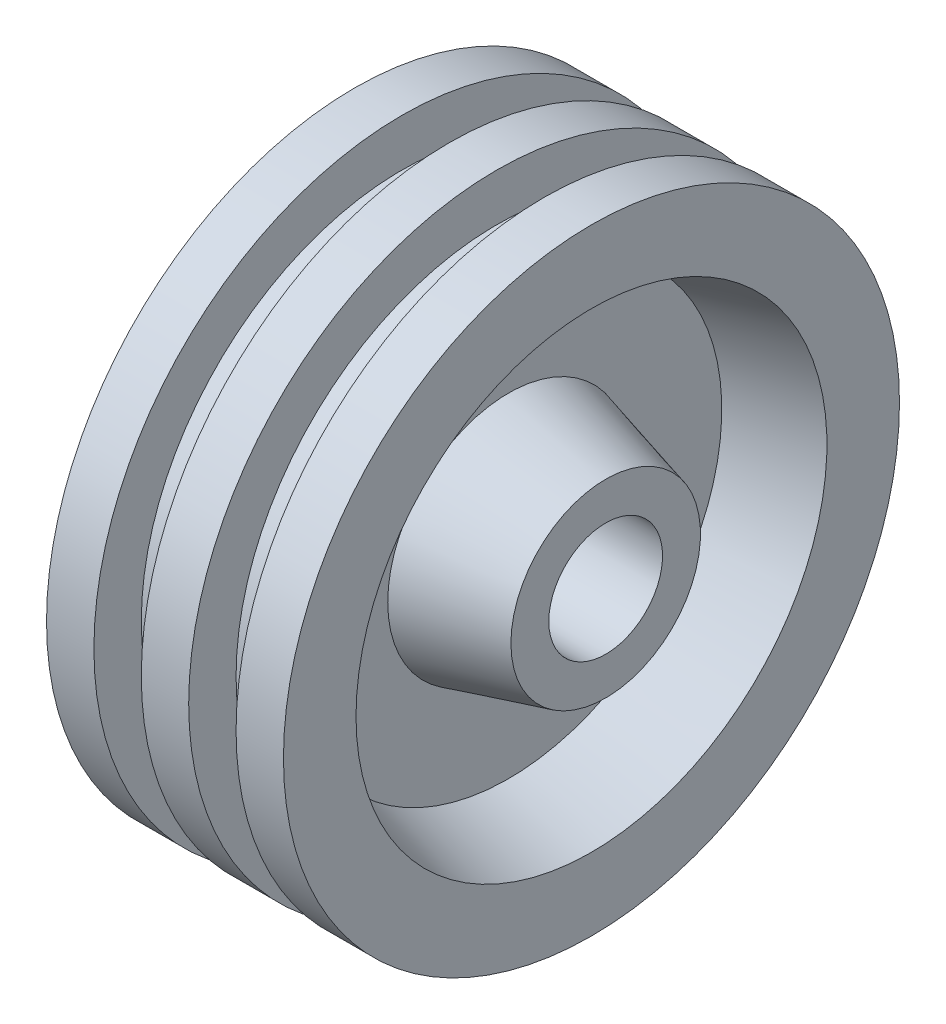
ISO-10303-21;
HEADER;
FILE_DESCRIPTION(('STEP AP214'),'2;1');
FILE_NAME('part.step','',(''),(''),'','','');
FILE_SCHEMA(('AUTOMOTIVE_DESIGN { 1 0 10303 214 1 1 1 1 }'));
ENDSEC;
DATA;
#1=APPLICATION_CONTEXT('core data for automotive mechanical design processes');
#2=APPLICATION_PROTOCOL_DEFINITION('international standard','automotive_design',2000,#1);
#3=PRODUCT_CONTEXT('',#1,'mechanical');
#4=PRODUCT('Part','Part','',(#3));
#5=PRODUCT_RELATED_PRODUCT_CATEGORY('part','',(#4));
#6=PRODUCT_DEFINITION_FORMATION('','',#4);
#7=PRODUCT_DEFINITION_CONTEXT('part definition',#1,'design');
#8=PRODUCT_DEFINITION('design','',#6,#7);
#9=PRODUCT_DEFINITION_SHAPE('','',#8);
#10=(LENGTH_UNIT() NAMED_UNIT(*) SI_UNIT(.MILLI.,.METRE.));
#11=(NAMED_UNIT(*) PLANE_ANGLE_UNIT() SI_UNIT($,.RADIAN.));
#12=(NAMED_UNIT(*) SI_UNIT($,.STERADIAN.) SOLID_ANGLE_UNIT());
#13=UNCERTAINTY_MEASURE_WITH_UNIT(LENGTH_MEASURE(1.E-05),#10,'distance_accuracy_value','');
#14=(GEOMETRIC_REPRESENTATION_CONTEXT(3) GLOBAL_UNCERTAINTY_ASSIGNED_CONTEXT((#13)) GLOBAL_UNIT_ASSIGNED_CONTEXT((#10,
#11,#12)) REPRESENTATION_CONTEXT('',''));
#15=CARTESIAN_POINT('',(0.,0.,0.));
#16=DIRECTION('',(0.,0.,1.));
#17=DIRECTION('',(1.,0.,0.));
#18=AXIS2_PLACEMENT_3D('',#15,#16,#17);
#19=CARTESIAN_POINT('',(-926.286562430031,0.,0.));
#20=DIRECTION('',(-1.,0.,0.));
#21=DIRECTION('',(0.,0.,0.999999999999997));
#22=AXIS2_PLACEMENT_3D('',#19,#20,#21);
#23=CYLINDRICAL_SURFACE('',#22,65.0000000000001);
#24=CARTESIAN_POINT('',(-3.33066907387547E-13,0.,0.));
#25=DIRECTION('',(-1.,0.,0.));
#26=DIRECTION('',(0.,0.,0.999999999999997));
#27=AXIS2_PLACEMENT_3D('',#24,#25,#26);
#28=CIRCLE('',#27,65.0000000000001);
#29=CARTESIAN_POINT('',(-3.33066907387547E-13,0.,65.));
#30=VERTEX_POINT('',#29);
#31=EDGE_CURVE('E12',#30,#30,#28,.T.);
#32=ORIENTED_EDGE('',*,*,#31,.F.);
#33=EDGE_LOOP('',(#32));
#34=FACE_BOUND('',#33,.T.);
#35=CARTESIAN_POINT('',(9.99999999999968,0.,0.));
#36=DIRECTION('',(-1.,0.,0.));
#37=DIRECTION('',(0.,0.,0.999999999999997));
#38=AXIS2_PLACEMENT_3D('',#35,#36,#37);
#39=CIRCLE('',#38,65.0000000000001);
#40=CARTESIAN_POINT('',(9.99999999999968,0.,65.));
#41=VERTEX_POINT('',#40);
#42=EDGE_CURVE('E104',#41,#41,#39,.T.);
#43=ORIENTED_EDGE('',*,*,#42,.T.);
#44=EDGE_LOOP('',(#43));
#45=FACE_BOUND('',#44,.T.);
#46=ADVANCED_FACE('F40',(#34,#45),#23,.T.);
#47=CARTESIAN_POINT('',(-1.81278603239576E-13,64.9999999999998,0.));
#48=DIRECTION('',(1.,0.,0.));
#49=DIRECTION('',(0.,0.,-0.999999999999997));
#50=AXIS2_PLACEMENT_3D('',#47,#48,#49);
#51=PLANE('',#50);
#52=CARTESIAN_POINT('',(0.,0.,0.));
#53=DIRECTION('',(-1.,0.,0.));
#54=DIRECTION('',(0.,0.,0.999999999999997));
#55=AXIS2_PLACEMENT_3D('',#52,#53,#54);
#56=CIRCLE('',#55,49.6891108675446);
#57=CARTESIAN_POINT('',(0.,0.,49.6891108675444));
#58=VERTEX_POINT('',#57);
#59=EDGE_CURVE('E46',#58,#58,#56,.T.);
#60=ORIENTED_EDGE('',*,*,#59,.F.);
#61=EDGE_LOOP('',(#60));
#62=FACE_BOUND('',#61,.T.);
#63=ORIENTED_EDGE('',*,*,#31,.T.);
#64=EDGE_LOOP('',(#63));
#65=FACE_BOUND('',#64,.T.);
#66=ADVANCED_FACE('F213',(#62,#65),#51,.F.);
#67=CARTESIAN_POINT('',(0.,0.,0.));
#68=DIRECTION('',(-1.,0.,0.));
#69=DIRECTION('',(0.,0.,0.999999999999997));
#70=AXIS2_PLACEMENT_3D('',#67,#68,#69);
#71=CONICAL_SURFACE('',#70,49.6891108675446,0.26179938779915);
#72=CARTESIAN_POINT('',(17.4999999999996,0.,0.));
#73=DIRECTION('',(-1.,0.,0.));
#74=DIRECTION('',(0.,0.,0.999999999999997));
#75=AXIS2_PLACEMENT_3D('',#72,#73,#74);
#76=CIRCLE('',#75,45.);
#77=CARTESIAN_POINT('',(17.4999999999996,0.,44.9999999999999));
#78=VERTEX_POINT('',#77);
#79=EDGE_CURVE('E50',#78,#78,#76,.T.);
#80=ORIENTED_EDGE('',*,*,#79,.F.);
#81=EDGE_LOOP('',(#80));
#82=FACE_BOUND('',#81,.T.);
#83=ORIENTED_EDGE('',*,*,#59,.T.);
#84=EDGE_LOOP('',(#83));
#85=FACE_BOUND('',#84,.T.);
#86=ADVANCED_FACE('F208',(#82,#85),#71,.F.);
#87=CARTESIAN_POINT('',(17.4999999999996,44.9999999999998,0.));
#88=DIRECTION('',(1.,0.,0.));
#89=DIRECTION('',(0.,0.,-0.999999999999997));
#90=AXIS2_PLACEMENT_3D('',#87,#88,#89);
#91=PLANE('',#90);
#92=CARTESIAN_POINT('',(17.4999999999996,0.,0.));
#93=DIRECTION('',(-1.,0.,0.));
#94=DIRECTION('',(0.,0.,0.999999999999997));
#95=AXIS2_PLACEMENT_3D('',#92,#93,#94);
#96=CIRCLE('',#95,20.);
#97=CARTESIAN_POINT('',(17.4999999999996,0.,19.9999999999999));
#98=VERTEX_POINT('',#97);
#99=EDGE_CURVE('E54',#98,#98,#96,.T.);
#100=ORIENTED_EDGE('',*,*,#99,.F.);
#101=EDGE_LOOP('',(#100));
#102=FACE_BOUND('',#101,.T.);
#103=ORIENTED_EDGE('',*,*,#79,.T.);
#104=EDGE_LOOP('',(#103));
#105=FACE_BOUND('',#104,.T.);
#106=ADVANCED_FACE('F202',(#102,#105),#91,.F.);
#107=CARTESIAN_POINT('',(-926.286562430031,0.,0.));
#108=DIRECTION('',(-1.,0.,0.));
#109=DIRECTION('',(0.,0.,0.999999999999997));
#110=AXIS2_PLACEMENT_3D('',#107,#108,#109);
#111=CYLINDRICAL_SURFACE('',#110,20.);
#112=CARTESIAN_POINT('',(12.9999999999997,0.,0.));
#113=DIRECTION('',(-1.,0.,0.));
#114=DIRECTION('',(0.,0.,0.999999999999997));
#115=AXIS2_PLACEMENT_3D('',#112,#113,#114);
#116=CIRCLE('',#115,20.);
#117=CARTESIAN_POINT('',(12.9999999999997,0.,19.9999999999999));
#118=VERTEX_POINT('',#117);
#119=EDGE_CURVE('E59',#118,#118,#116,.T.);
#120=ORIENTED_EDGE('',*,*,#119,.F.);
#121=EDGE_LOOP('',(#120));
#122=FACE_BOUND('',#121,.T.);
#123=ORIENTED_EDGE('',*,*,#99,.T.);
#124=EDGE_LOOP('',(#123));
#125=FACE_BOUND('',#124,.T.);
#126=ADVANCED_FACE('F196',(#122,#125),#111,.T.);
#127=CARTESIAN_POINT('',(12.9999999999996,19.9999999999999,0.));
#128=DIRECTION('',(1.,0.,0.));
#129=DIRECTION('',(0.,0.,-0.999999999999997));
#130=AXIS2_PLACEMENT_3D('',#127,#128,#129);
#131=PLANE('',#130);
#132=CARTESIAN_POINT('',(12.9999999999997,0.,0.));
#133=DIRECTION('',(-1.,0.,0.));
#134=DIRECTION('',(0.,0.,0.999999999999997));
#135=AXIS2_PLACEMENT_3D('',#132,#133,#134);
#136=CIRCLE('',#135,12.);
#137=CARTESIAN_POINT('',(12.9999999999997,0.,12.));
#138=VERTEX_POINT('',#137);
#139=EDGE_CURVE('E62',#138,#138,#136,.T.);
#140=ORIENTED_EDGE('',*,*,#139,.F.);
#141=EDGE_LOOP('',(#140));
#142=FACE_BOUND('',#141,.T.);
#143=ORIENTED_EDGE('',*,*,#119,.T.);
#144=EDGE_LOOP('',(#143));
#145=FACE_BOUND('',#144,.T.);
#146=ADVANCED_FACE('F190',(#142,#145),#131,.F.);
#147=CARTESIAN_POINT('',(-926.286562430031,0.,0.));
#148=DIRECTION('',(-1.,0.,0.));
#149=DIRECTION('',(0.,0.,0.999999999999997));
#150=AXIS2_PLACEMENT_3D('',#147,#148,#149);
#151=CYLINDRICAL_SURFACE('',#150,12.);
#152=CARTESIAN_POINT('',(52.9999999999996,0.,0.));
#153=DIRECTION('',(-1.,0.,0.));
#154=DIRECTION('',(0.,0.,0.999999999999997));
#155=AXIS2_PLACEMENT_3D('',#152,#153,#154);
#156=CIRCLE('',#155,12.);
#157=CARTESIAN_POINT('',(52.9999999999996,0.,12.));
#158=VERTEX_POINT('',#157);
#159=EDGE_CURVE('E65',#158,#158,#156,.T.);
#160=ORIENTED_EDGE('',*,*,#159,.F.);
#161=EDGE_LOOP('',(#160));
#162=FACE_BOUND('',#161,.T.);
#163=ORIENTED_EDGE('',*,*,#139,.T.);
#164=EDGE_LOOP('',(#163));
#165=FACE_BOUND('',#164,.T.);
#166=ADVANCED_FACE('F184',(#162,#165),#151,.F.);
#167=CARTESIAN_POINT('',(52.9999999999996,12.,0.));
#168=DIRECTION('',(-1.,0.,0.));
#169=DIRECTION('',(0.,0.,0.999999999999997));
#170=AXIS2_PLACEMENT_3D('',#167,#168,#169);
#171=PLANE('',#170);
#172=CARTESIAN_POINT('',(52.9999999999996,0.,0.));
#173=DIRECTION('',(-1.,0.,0.));
#174=DIRECTION('',(0.,0.,0.999999999999997));
#175=AXIS2_PLACEMENT_3D('',#172,#173,#174);
#176=CIRCLE('',#175,20.);
#177=CARTESIAN_POINT('',(52.9999999999996,0.,19.9999999999999));
#178=VERTEX_POINT('',#177);
#179=EDGE_CURVE('E68',#178,#178,#176,.T.);
#180=ORIENTED_EDGE('',*,*,#179,.F.);
#181=EDGE_LOOP('',(#180));
#182=FACE_BOUND('',#181,.T.);
#183=ORIENTED_EDGE('',*,*,#159,.T.);
#184=EDGE_LOOP('',(#183));
#185=FACE_BOUND('',#184,.T.);
#186=ADVANCED_FACE('F178',(#182,#185),#171,.F.);
#187=CARTESIAN_POINT('',(52.9999999999996,0.,0.));
#188=DIRECTION('',(-1.,0.,0.));
#189=DIRECTION('',(0.,0.,0.999999999999997));
#190=AXIS2_PLACEMENT_3D('',#187,#188,#189);
#191=CONICAL_SURFACE('',#190,20.,0.26179938779915);
#192=CARTESIAN_POINT('',(32.4999999999996,0.,0.));
#193=DIRECTION('',(-1.,0.,0.));
#194=DIRECTION('',(0.,0.,0.999999999999997));
#195=AXIS2_PLACEMENT_3D('',#192,#193,#194);
#196=CIRCLE('',#195,25.492958444838);
#197=CARTESIAN_POINT('',(32.4999999999996,0.,25.4929584448379));
#198=VERTEX_POINT('',#197);
#199=EDGE_CURVE('E71',#198,#198,#196,.T.);
#200=ORIENTED_EDGE('',*,*,#199,.F.);
#201=EDGE_LOOP('',(#200));
#202=FACE_BOUND('',#201,.T.);
#203=ORIENTED_EDGE('',*,*,#179,.T.);
#204=EDGE_LOOP('',(#203));
#205=FACE_BOUND('',#204,.T.);
#206=ADVANCED_FACE('F172',(#202,#205),#191,.T.);
#207=CARTESIAN_POINT('',(32.4999999999996,25.492958444838,0.));
#208=DIRECTION('',(-1.,0.,0.));
#209=DIRECTION('',(0.,0.,0.999999999999997));
#210=AXIS2_PLACEMENT_3D('',#207,#208,#209);
#211=PLANE('',#210);
#212=CARTESIAN_POINT('',(32.4999999999996,0.,0.));
#213=DIRECTION('',(-1.,0.,0.));
#214=DIRECTION('',(0.,0.,0.999999999999997));
#215=AXIS2_PLACEMENT_3D('',#212,#213,#214);
#216=CIRCLE('',#215,45.);
#217=CARTESIAN_POINT('',(32.4999999999996,0.,44.9999999999999));
#218=VERTEX_POINT('',#217);
#219=EDGE_CURVE('E74',#218,#218,#216,.T.);
#220=ORIENTED_EDGE('',*,*,#219,.F.);
#221=EDGE_LOOP('',(#220));
#222=FACE_BOUND('',#221,.T.);
#223=ORIENTED_EDGE('',*,*,#199,.T.);
#224=EDGE_LOOP('',(#223));
#225=FACE_BOUND('',#224,.T.);
#226=ADVANCED_FACE('F166',(#222,#225),#211,.F.);
#227=CARTESIAN_POINT('',(32.4999999999996,0.,0.));
#228=DIRECTION('',(1.,0.,0.));
#229=DIRECTION('',(0.,0.,-0.999999999999997));
#230=AXIS2_PLACEMENT_3D('',#227,#228,#229);
#231=CONICAL_SURFACE('',#230,45.,0.261799387799151);
#232=CARTESIAN_POINT('',(49.9999999999996,0.,0.));
#233=DIRECTION('',(-1.,0.,0.));
#234=DIRECTION('',(0.,0.,0.999999999999997));
#235=AXIS2_PLACEMENT_3D('',#232,#233,#234);
#236=CIRCLE('',#235,49.6891108675447);
#237=CARTESIAN_POINT('',(49.9999999999996,0.,49.6891108675445));
#238=VERTEX_POINT('',#237);
#239=EDGE_CURVE('E77',#238,#238,#236,.T.);
#240=ORIENTED_EDGE('',*,*,#239,.F.);
#241=EDGE_LOOP('',(#240));
#242=FACE_BOUND('',#241,.T.);
#243=ORIENTED_EDGE('',*,*,#219,.T.);
#244=EDGE_LOOP('',(#243));
#245=FACE_BOUND('',#244,.T.);
#246=ADVANCED_FACE('F160',(#242,#245),#231,.F.);
#247=CARTESIAN_POINT('',(49.9999999999996,49.6891108675445,0.));
#248=DIRECTION('',(-1.,0.,0.));
#249=DIRECTION('',(0.,0.,0.999999999999997));
#250=AXIS2_PLACEMENT_3D('',#247,#248,#249);
#251=PLANE('',#250);
#252=CARTESIAN_POINT('',(49.9999999999996,0.,0.));
#253=DIRECTION('',(-1.,0.,0.));
#254=DIRECTION('',(0.,0.,0.999999999999997));
#255=AXIS2_PLACEMENT_3D('',#252,#253,#254);
#256=CIRCLE('',#255,65.0000000000001);
#257=CARTESIAN_POINT('',(49.9999999999996,0.,64.9999999999999));
#258=VERTEX_POINT('',#257);
#259=EDGE_CURVE('E80',#258,#258,#256,.T.);
#260=ORIENTED_EDGE('',*,*,#259,.F.);
#261=EDGE_LOOP('',(#260));
#262=FACE_BOUND('',#261,.T.);
#263=ORIENTED_EDGE('',*,*,#239,.T.);
#264=EDGE_LOOP('',(#263));
#265=FACE_BOUND('',#264,.T.);
#266=ADVANCED_FACE('F154',(#262,#265),#251,.F.);
#267=CARTESIAN_POINT('',(-926.286562430031,0.,0.));
#268=DIRECTION('',(-1.,0.,0.));
#269=DIRECTION('',(0.,0.,0.999999999999997));
#270=AXIS2_PLACEMENT_3D('',#267,#268,#269);
#271=CYLINDRICAL_SURFACE('',#270,65.0000000000001);
#272=CARTESIAN_POINT('',(39.9999999999996,0.,0.));
#273=DIRECTION('',(-1.,0.,0.));
#274=DIRECTION('',(0.,0.,0.999999999999997));
#275=AXIS2_PLACEMENT_3D('',#272,#273,#274);
#276=CIRCLE('',#275,65.0000000000001);
#277=CARTESIAN_POINT('',(39.9999999999996,0.,65.));
#278=VERTEX_POINT('',#277);
#279=EDGE_CURVE('E83',#278,#278,#276,.T.);
#280=ORIENTED_EDGE('',*,*,#279,.F.);
#281=EDGE_LOOP('',(#280));
#282=FACE_BOUND('',#281,.T.);
#283=ORIENTED_EDGE('',*,*,#259,.T.);
#284=EDGE_LOOP('',(#283));
#285=FACE_BOUND('',#284,.T.);
#286=ADVANCED_FACE('F148',(#282,#285),#271,.T.);
#287=CARTESIAN_POINT('',(39.9999999999996,64.9999999999998,0.));
#288=DIRECTION('',(1.,0.,0.));
#289=DIRECTION('',(0.,0.,-0.999999999999997));
#290=AXIS2_PLACEMENT_3D('',#287,#288,#289);
#291=PLANE('',#290);
#292=CARTESIAN_POINT('',(39.9999999999996,0.,0.));
#293=DIRECTION('',(-1.,0.,0.));
#294=DIRECTION('',(0.,0.,0.999999999999997));
#295=AXIS2_PLACEMENT_3D('',#292,#293,#294);
#296=CIRCLE('',#295,55.0000000000001);
#297=CARTESIAN_POINT('',(39.9999999999996,0.,55.));
#298=VERTEX_POINT('',#297);
#299=EDGE_CURVE('E86',#298,#298,#296,.T.);
#300=ORIENTED_EDGE('',*,*,#299,.F.);
#301=EDGE_LOOP('',(#300));
#302=FACE_BOUND('',#301,.T.);
#303=ORIENTED_EDGE('',*,*,#279,.T.);
#304=EDGE_LOOP('',(#303));
#305=FACE_BOUND('',#304,.T.);
#306=ADVANCED_FACE('F142',(#302,#305),#291,.F.);
#307=CARTESIAN_POINT('',(-926.286562430031,0.,0.));
#308=DIRECTION('',(-1.,0.,0.));
#309=DIRECTION('',(0.,0.,0.999999999999997));
#310=AXIS2_PLACEMENT_3D('',#307,#308,#309);
#311=CYLINDRICAL_SURFACE('',#310,55.0000000000001);
#312=CARTESIAN_POINT('',(29.9999999999996,0.,0.));
#313=DIRECTION('',(-1.,0.,0.));
#314=DIRECTION('',(0.,0.,0.999999999999997));
#315=AXIS2_PLACEMENT_3D('',#312,#313,#314);
#316=CIRCLE('',#315,55.0000000000001);
#317=CARTESIAN_POINT('',(29.9999999999996,0.,55.));
#318=VERTEX_POINT('',#317);
#319=EDGE_CURVE('E89',#318,#318,#316,.T.);
#320=ORIENTED_EDGE('',*,*,#319,.F.);
#321=EDGE_LOOP('',(#320));
#322=FACE_BOUND('',#321,.T.);
#323=ORIENTED_EDGE('',*,*,#299,.T.);
#324=EDGE_LOOP('',(#323));
#325=FACE_BOUND('',#324,.T.);
#326=ADVANCED_FACE('F136',(#322,#325),#311,.T.);
#327=CARTESIAN_POINT('',(29.9999999999996,55.,0.));
#328=DIRECTION('',(-1.,0.,0.));
#329=DIRECTION('',(0.,0.,0.999999999999997));
#330=AXIS2_PLACEMENT_3D('',#327,#328,#329);
#331=PLANE('',#330);
#332=CARTESIAN_POINT('',(29.9999999999996,0.,0.));
#333=DIRECTION('',(-1.,0.,0.));
#334=DIRECTION('',(0.,0.,0.999999999999997));
#335=AXIS2_PLACEMENT_3D('',#332,#333,#334);
#336=CIRCLE('',#335,65.0000000000001);
#337=CARTESIAN_POINT('',(29.9999999999996,0.,65.));
#338=VERTEX_POINT('',#337);
#339=EDGE_CURVE('E92',#338,#338,#336,.T.);
#340=ORIENTED_EDGE('',*,*,#339,.F.);
#341=EDGE_LOOP('',(#340));
#342=FACE_BOUND('',#341,.T.);
#343=ORIENTED_EDGE('',*,*,#319,.T.);
#344=EDGE_LOOP('',(#343));
#345=FACE_BOUND('',#344,.T.);
#346=ADVANCED_FACE('F130',(#342,#345),#331,.F.);
#347=CARTESIAN_POINT('',(-926.286562430031,0.,0.));
#348=DIRECTION('',(-1.,0.,0.));
#349=DIRECTION('',(0.,0.,0.999999999999997));
#350=AXIS2_PLACEMENT_3D('',#347,#348,#349);
#351=CYLINDRICAL_SURFACE('',#350,65.0000000000001);
#352=CARTESIAN_POINT('',(19.9999999999997,0.,0.));
#353=DIRECTION('',(-1.,0.,0.));
#354=DIRECTION('',(0.,0.,0.999999999999997));
#355=AXIS2_PLACEMENT_3D('',#352,#353,#354);
#356=CIRCLE('',#355,65.0000000000001);
#357=CARTESIAN_POINT('',(19.9999999999997,0.,65.));
#358=VERTEX_POINT('',#357);
#359=EDGE_CURVE('E95',#358,#358,#356,.T.);
#360=ORIENTED_EDGE('',*,*,#359,.F.);
#361=EDGE_LOOP('',(#360));
#362=FACE_BOUND('',#361,.T.);
#363=ORIENTED_EDGE('',*,*,#339,.T.);
#364=EDGE_LOOP('',(#363));
#365=FACE_BOUND('',#364,.T.);
#366=ADVANCED_FACE('F124',(#362,#365),#351,.T.);
#367=CARTESIAN_POINT('',(19.9999999999996,64.9999999999998,0.));
#368=DIRECTION('',(1.,0.,0.));
#369=DIRECTION('',(0.,0.,-0.999999999999997));
#370=AXIS2_PLACEMENT_3D('',#367,#368,#369);
#371=PLANE('',#370);
#372=CARTESIAN_POINT('',(19.9999999999997,0.,0.));
#373=DIRECTION('',(-1.,0.,0.));
#374=DIRECTION('',(0.,0.,0.999999999999997));
#375=AXIS2_PLACEMENT_3D('',#372,#373,#374);
#376=CIRCLE('',#375,55.0000000000001);
#377=CARTESIAN_POINT('',(19.9999999999997,0.,55.));
#378=VERTEX_POINT('',#377);
#379=EDGE_CURVE('E98',#378,#378,#376,.T.);
#380=ORIENTED_EDGE('',*,*,#379,.F.);
#381=EDGE_LOOP('',(#380));
#382=FACE_BOUND('',#381,.T.);
#383=ORIENTED_EDGE('',*,*,#359,.T.);
#384=EDGE_LOOP('',(#383));
#385=FACE_BOUND('',#384,.T.);
#386=ADVANCED_FACE('F118',(#382,#385),#371,.F.);
#387=CARTESIAN_POINT('',(-926.286562430031,0.,0.));
#388=DIRECTION('',(-1.,0.,0.));
#389=DIRECTION('',(0.,0.,0.999999999999997));
#390=AXIS2_PLACEMENT_3D('',#387,#388,#389);
#391=CYLINDRICAL_SURFACE('',#390,55.0000000000001);
#392=CARTESIAN_POINT('',(9.99999999999968,0.,0.));
#393=DIRECTION('',(-1.,0.,0.));
#394=DIRECTION('',(0.,0.,0.999999999999997));
#395=AXIS2_PLACEMENT_3D('',#392,#393,#394);
#396=CIRCLE('',#395,55.0000000000001);
#397=CARTESIAN_POINT('',(9.99999999999968,0.,55.));
#398=VERTEX_POINT('',#397);
#399=EDGE_CURVE('E101',#398,#398,#396,.T.);
#400=ORIENTED_EDGE('',*,*,#399,.F.);
#401=EDGE_LOOP('',(#400));
#402=FACE_BOUND('',#401,.T.);
#403=ORIENTED_EDGE('',*,*,#379,.T.);
#404=EDGE_LOOP('',(#403));
#405=FACE_BOUND('',#404,.T.);
#406=ADVANCED_FACE('F112',(#402,#405),#391,.T.);
#407=CARTESIAN_POINT('',(9.99999999999964,55.,0.));
#408=DIRECTION('',(-1.,0.,0.));
#409=DIRECTION('',(0.,0.,0.999999999999997));
#410=AXIS2_PLACEMENT_3D('',#407,#408,#409);
#411=PLANE('',#410);
#412=ORIENTED_EDGE('',*,*,#42,.F.);
#413=EDGE_LOOP('',(#412));
#414=FACE_BOUND('',#413,.T.);
#415=ORIENTED_EDGE('',*,*,#399,.T.);
#416=EDGE_LOOP('',(#415));
#417=FACE_BOUND('',#416,.T.);
#418=ADVANCED_FACE('F109',(#414,#417),#411,.F.);
#419=CLOSED_SHELL('',(#46,#66,#86,#106,#126,#146,#166,#186,#206,#226,#246,#266,#286,#306,#326,
#346,#366,#386,#406,#418));
#420=MANIFOLD_SOLID_BREP('B2',#419);
#421=ADVANCED_BREP_SHAPE_REPRESENTATION('',(#18,#420),#14);
#422=SHAPE_DEFINITION_REPRESENTATION(#9,#421);
ENDSEC;
END-ISO-10303-21;
